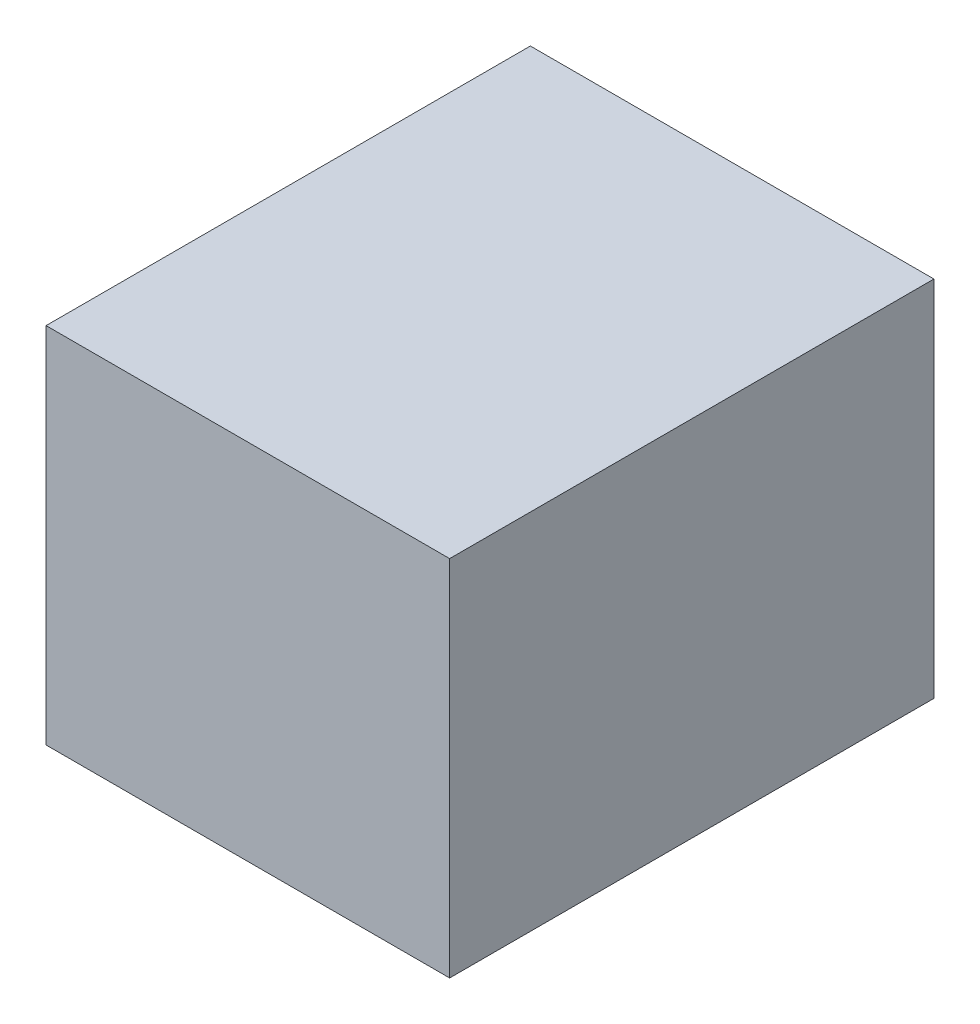
ISO-10303-21;
HEADER;
FILE_DESCRIPTION(('STEP AP214'),'2;1');
FILE_NAME('part.step','',(''),(''),'','','');
FILE_SCHEMA(('AUTOMOTIVE_DESIGN { 1 0 10303 214 1 1 1 1 }'));
ENDSEC;
DATA;
#1=APPLICATION_CONTEXT('core data for automotive mechanical design processes');
#2=APPLICATION_PROTOCOL_DEFINITION('international standard','automotive_design',2000,#1);
#3=PRODUCT_CONTEXT('',#1,'mechanical');
#4=PRODUCT('Part','Part','',(#3));
#5=PRODUCT_RELATED_PRODUCT_CATEGORY('part','',(#4));
#6=PRODUCT_DEFINITION_FORMATION('','',#4);
#7=PRODUCT_DEFINITION_CONTEXT('part definition',#1,'design');
#8=PRODUCT_DEFINITION('design','',#6,#7);
#9=PRODUCT_DEFINITION_SHAPE('','',#8);
#10=(LENGTH_UNIT() NAMED_UNIT(*) SI_UNIT(.MILLI.,.METRE.));
#11=(NAMED_UNIT(*) PLANE_ANGLE_UNIT() SI_UNIT($,.RADIAN.));
#12=(NAMED_UNIT(*) SI_UNIT($,.STERADIAN.) SOLID_ANGLE_UNIT());
#13=UNCERTAINTY_MEASURE_WITH_UNIT(LENGTH_MEASURE(1.E-05),#10,'distance_accuracy_value','');
#14=(GEOMETRIC_REPRESENTATION_CONTEXT(3) GLOBAL_UNCERTAINTY_ASSIGNED_CONTEXT((#13)) GLOBAL_UNIT_ASSIGNED_CONTEXT((#10,
#11,#12)) REPRESENTATION_CONTEXT('',''));
#15=CARTESIAN_POINT('',(0.,0.,0.));
#16=DIRECTION('',(0.,0.,1.));
#17=DIRECTION('',(1.,0.,0.));
#18=AXIS2_PLACEMENT_3D('',#15,#16,#17);
#19=CARTESIAN_POINT('',(50.,45.,120.));
#20=DIRECTION('',(-1.,0.,0.));
#21=DIRECTION('',(0.,-1.,0.));
#22=AXIS2_PLACEMENT_3D('',#19,#20,#21);
#23=PLANE('',#22);
#24=DIRECTION('',(0.,1.,0.));
#25=VECTOR('',#24,1.);
#26=CARTESIAN_POINT('',(50.,45.,0.));
#27=LINE('',#26,#25);
#28=CARTESIAN_POINT('',(50.,-45.,0.));
#29=VERTEX_POINT('',#28);
#30=CARTESIAN_POINT('',(50.,45.,0.));
#31=VERTEX_POINT('',#30);
#32=EDGE_CURVE('E107',#29,#31,#27,.T.);
#33=ORIENTED_EDGE('',*,*,#32,.T.);
#34=DIRECTION('',(0.,0.,-1.));
#35=VECTOR('',#34,1.);
#36=CARTESIAN_POINT('',(50.,45.,120.));
#37=LINE('',#36,#35);
#38=CARTESIAN_POINT('',(50.,45.,120.));
#39=VERTEX_POINT('',#38);
#40=EDGE_CURVE('E11',#39,#31,#37,.T.);
#41=ORIENTED_EDGE('',*,*,#40,.F.);
#42=DIRECTION('',(0.,1.,0.));
#43=VECTOR('',#42,1.);
#44=CARTESIAN_POINT('',(50.,45.,120.));
#45=LINE('',#44,#43);
#46=CARTESIAN_POINT('',(50.,-45.,120.));
#47=VERTEX_POINT('',#46);
#48=EDGE_CURVE('E91',#47,#39,#45,.T.);
#49=ORIENTED_EDGE('',*,*,#48,.F.);
#50=DIRECTION('',(0.,0.,-1.));
#51=VECTOR('',#50,1.);
#52=CARTESIAN_POINT('',(50.,-45.,120.));
#53=LINE('',#52,#51);
#54=EDGE_CURVE('E103',#47,#29,#53,.T.);
#55=ORIENTED_EDGE('',*,*,#54,.T.);
#56=EDGE_LOOP('',(#33,#41,#49,#55));
#57=FACE_BOUND('',#56,.T.);
#58=ADVANCED_FACE('F39',(#57),#23,.F.);
#59=CARTESIAN_POINT('',(-50.,45.,120.));
#60=DIRECTION('',(0.,-1.,0.));
#61=DIRECTION('',(0.,0.,-1.));
#62=AXIS2_PLACEMENT_3D('',#59,#60,#61);
#63=PLANE('',#62);
#64=DIRECTION('',(-1.,0.,0.));
#65=VECTOR('',#64,1.);
#66=CARTESIAN_POINT('',(-50.,45.,0.));
#67=LINE('',#66,#65);
#68=CARTESIAN_POINT('',(-50.,45.,0.));
#69=VERTEX_POINT('',#68);
#70=EDGE_CURVE('E96',#31,#69,#67,.T.);
#71=ORIENTED_EDGE('',*,*,#70,.T.);
#72=DIRECTION('',(0.,0.,-1.));
#73=VECTOR('',#72,1.);
#74=CARTESIAN_POINT('',(-50.,45.,120.));
#75=LINE('',#74,#73);
#76=CARTESIAN_POINT('',(-50.,45.,120.));
#77=VERTEX_POINT('',#76);
#78=EDGE_CURVE('E48',#77,#69,#75,.T.);
#79=ORIENTED_EDGE('',*,*,#78,.F.);
#80=DIRECTION('',(-1.,0.,0.));
#81=VECTOR('',#80,1.);
#82=CARTESIAN_POINT('',(-50.,45.,120.));
#83=LINE('',#82,#81);
#84=EDGE_CURVE('E86',#39,#77,#83,.T.);
#85=ORIENTED_EDGE('',*,*,#84,.F.);
#86=ORIENTED_EDGE('',*,*,#40,.T.);
#87=EDGE_LOOP('',(#71,#79,#85,#86));
#88=FACE_BOUND('',#87,.T.);
#89=ADVANCED_FACE('F95',(#88),#63,.F.);
#90=CARTESIAN_POINT('',(-50.,45.,120.));
#91=DIRECTION('',(1.,0.,0.));
#92=DIRECTION('',(0.,1.,0.));
#93=AXIS2_PLACEMENT_3D('',#90,#91,#92);
#94=PLANE('',#93);
#95=DIRECTION('',(0.,-1.,0.));
#96=VECTOR('',#95,1.);
#97=CARTESIAN_POINT('',(-50.,45.,0.));
#98=LINE('',#97,#96);
#99=CARTESIAN_POINT('',(-50.,-45.,0.));
#100=VERTEX_POINT('',#99);
#101=EDGE_CURVE('E73',#69,#100,#98,.T.);
#102=ORIENTED_EDGE('',*,*,#101,.T.);
#103=DIRECTION('',(0.,0.,-1.));
#104=VECTOR('',#103,1.);
#105=CARTESIAN_POINT('',(-50.,-45.,120.));
#106=LINE('',#105,#104);
#107=CARTESIAN_POINT('',(-50.,-45.,120.));
#108=VERTEX_POINT('',#107);
#109=EDGE_CURVE('E98',#108,#100,#106,.T.);
#110=ORIENTED_EDGE('',*,*,#109,.F.);
#111=DIRECTION('',(0.,-1.,0.));
#112=VECTOR('',#111,1.);
#113=CARTESIAN_POINT('',(-50.,45.,120.));
#114=LINE('',#113,#112);
#115=EDGE_CURVE('E89',#77,#108,#114,.T.);
#116=ORIENTED_EDGE('',*,*,#115,.F.);
#117=ORIENTED_EDGE('',*,*,#78,.T.);
#118=EDGE_LOOP('',(#102,#110,#116,#117));
#119=FACE_BOUND('',#118,.T.);
#120=ADVANCED_FACE('F99',(#119),#94,.F.);
#121=CARTESIAN_POINT('',(-50.,-45.,120.));
#122=DIRECTION('',(0.,1.,0.));
#123=DIRECTION('',(0.,0.,1.));
#124=AXIS2_PLACEMENT_3D('',#121,#122,#123);
#125=PLANE('',#124);
#126=DIRECTION('',(1.,0.,0.));
#127=VECTOR('',#126,1.);
#128=CARTESIAN_POINT('',(-50.,-45.,0.));
#129=LINE('',#128,#127);
#130=EDGE_CURVE('E79',#100,#29,#129,.T.);
#131=ORIENTED_EDGE('',*,*,#130,.T.);
#132=ORIENTED_EDGE('',*,*,#54,.F.);
#133=DIRECTION('',(1.,0.,0.));
#134=VECTOR('',#133,1.);
#135=CARTESIAN_POINT('',(-50.,-45.,120.));
#136=LINE('',#135,#134);
#137=EDGE_CURVE('E56',#108,#47,#136,.T.);
#138=ORIENTED_EDGE('',*,*,#137,.F.);
#139=ORIENTED_EDGE('',*,*,#109,.T.);
#140=EDGE_LOOP('',(#131,#132,#138,#139));
#141=FACE_BOUND('',#140,.T.);
#142=ADVANCED_FACE('F120',(#141),#125,.F.);
#143=CARTESIAN_POINT('',(0.,0.,120.));
#144=DIRECTION('',(0.,0.,1.));
#145=DIRECTION('',(1.,0.,0.));
#146=AXIS2_PLACEMENT_3D('',#143,#144,#145);
#147=PLANE('',#146);
#148=ORIENTED_EDGE('',*,*,#48,.T.);
#149=ORIENTED_EDGE('',*,*,#84,.T.);
#150=ORIENTED_EDGE('',*,*,#115,.T.);
#151=ORIENTED_EDGE('',*,*,#137,.T.);
#152=EDGE_LOOP('',(#148,#149,#150,#151));
#153=FACE_BOUND('',#152,.T.);
#154=ADVANCED_FACE('F87',(#153),#147,.T.);
#155=CARTESIAN_POINT('',(0.,0.,0.));
#156=DIRECTION('',(0.,0.,1.));
#157=DIRECTION('',(1.,0.,0.));
#158=AXIS2_PLACEMENT_3D('',#155,#156,#157);
#159=PLANE('',#158);
#160=ORIENTED_EDGE('',*,*,#32,.F.);
#161=ORIENTED_EDGE('',*,*,#130,.F.);
#162=ORIENTED_EDGE('',*,*,#101,.F.);
#163=ORIENTED_EDGE('',*,*,#70,.F.);
#164=EDGE_LOOP('',(#160,#161,#162,#163));
#165=FACE_BOUND('',#164,.T.);
#166=ADVANCED_FACE('F123',(#165),#159,.F.);
#167=CLOSED_SHELL('',(#58,#89,#120,#142,#154,#166));
#168=MANIFOLD_SOLID_BREP('B2',#167);
#169=ADVANCED_BREP_SHAPE_REPRESENTATION('',(#18,#168),#14);
#170=SHAPE_DEFINITION_REPRESENTATION(#9,#169);
ENDSEC;
END-ISO-10303-21;
